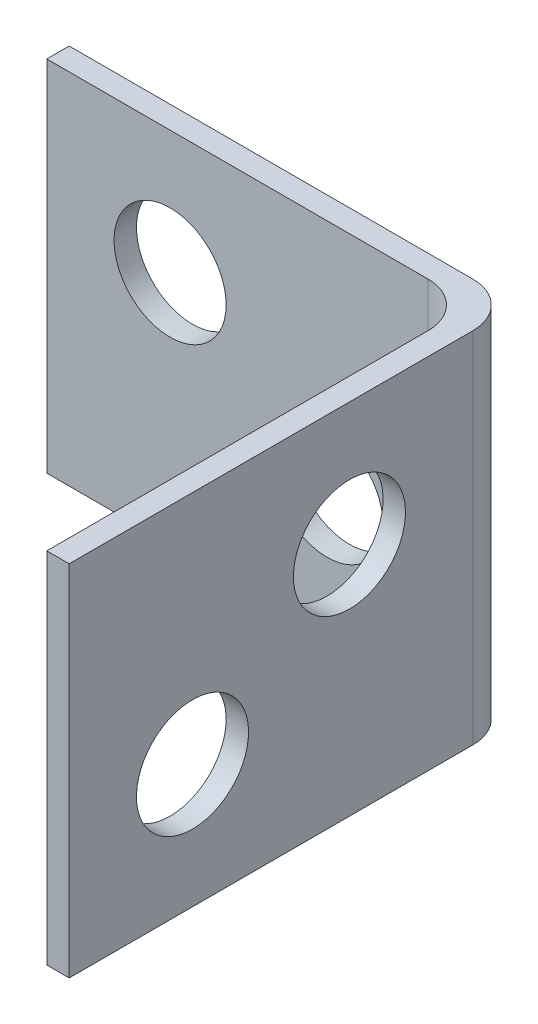
ISO-10303-21;
HEADER;
FILE_DESCRIPTION(('STEP AP214'),'2;1');
FILE_NAME('part.step','',(''),(''),'','','');
FILE_SCHEMA(('AUTOMOTIVE_DESIGN { 1 0 10303 214 1 1 1 1 }'));
ENDSEC;
DATA;
#1=APPLICATION_CONTEXT('core data for automotive mechanical design processes');
#2=APPLICATION_PROTOCOL_DEFINITION('international standard','automotive_design',2000,#1);
#3=PRODUCT_CONTEXT('',#1,'mechanical');
#4=PRODUCT('Part','Part','',(#3));
#5=PRODUCT_RELATED_PRODUCT_CATEGORY('part','',(#4));
#6=PRODUCT_DEFINITION_FORMATION('','',#4);
#7=PRODUCT_DEFINITION_CONTEXT('part definition',#1,'design');
#8=PRODUCT_DEFINITION('design','',#6,#7);
#9=PRODUCT_DEFINITION_SHAPE('','',#8);
#10=(LENGTH_UNIT() NAMED_UNIT(*) SI_UNIT(.MILLI.,.METRE.));
#11=(NAMED_UNIT(*) PLANE_ANGLE_UNIT() SI_UNIT($,.RADIAN.));
#12=(NAMED_UNIT(*) SI_UNIT($,.STERADIAN.) SOLID_ANGLE_UNIT());
#13=UNCERTAINTY_MEASURE_WITH_UNIT(LENGTH_MEASURE(1.E-05),#10,'distance_accuracy_value','');
#14=(GEOMETRIC_REPRESENTATION_CONTEXT(3) GLOBAL_UNCERTAINTY_ASSIGNED_CONTEXT((#13)) GLOBAL_UNIT_ASSIGNED_CONTEXT((#10,
#11,#12)) REPRESENTATION_CONTEXT('',''));
#15=CARTESIAN_POINT('',(0.,0.,0.));
#16=DIRECTION('',(0.,0.,1.));
#17=DIRECTION('',(1.,0.,0.));
#18=AXIS2_PLACEMENT_3D('',#15,#16,#17);
#19=CARTESIAN_POINT('',(0.,0.,1.));
#20=DIRECTION('',(0.,0.,-1.));
#21=DIRECTION('',(-1.,0.,0.));
#22=AXIS2_PLACEMENT_3D('',#19,#20,#21);
#23=PLANE('',#22);
#24=CARTESIAN_POINT('',(12.5,5.5,1.));
#25=DIRECTION('',(0.,0.,1.));
#26=DIRECTION('',(1.,0.,0.));
#27=AXIS2_PLACEMENT_3D('',#24,#25,#26);
#28=CIRCLE('',#27,2.5);
#29=CARTESIAN_POINT('',(15.,5.5,1.));
#30=VERTEX_POINT('',#29);
#31=EDGE_CURVE('E152',#30,#30,#28,.T.);
#32=ORIENTED_EDGE('',*,*,#31,.F.);
#33=EDGE_LOOP('',(#32));
#34=FACE_BOUND('',#33,.T.);
#35=CARTESIAN_POINT('',(5.5,10.5,1.));
#36=DIRECTION('',(0.,0.,1.));
#37=DIRECTION('',(1.,0.,0.));
#38=AXIS2_PLACEMENT_3D('',#35,#36,#37);
#39=CIRCLE('',#38,2.5);
#40=CARTESIAN_POINT('',(8.,10.5,1.));
#41=VERTEX_POINT('',#40);
#42=EDGE_CURVE('E160',#41,#41,#39,.T.);
#43=ORIENTED_EDGE('',*,*,#42,.F.);
#44=EDGE_LOOP('',(#43));
#45=FACE_BOUND('',#44,.T.);
#46=DIRECTION('',(1.,0.,0.));
#47=VECTOR('',#46,1.);
#48=CARTESIAN_POINT('',(0.,0.,1.));
#49=LINE('',#48,#47);
#50=CARTESIAN_POINT('',(0.,0.,1.));
#51=VERTEX_POINT('',#50);
#52=CARTESIAN_POINT('',(17.,0.,1.));
#53=VERTEX_POINT('',#52);
#54=EDGE_CURVE('E172',#51,#53,#49,.T.);
#55=ORIENTED_EDGE('',*,*,#54,.T.);
#56=DIRECTION('',(0.,-1.,0.));
#57=VECTOR('',#56,1.);
#58=CARTESIAN_POINT('',(17.,16.,1.));
#59=LINE('',#58,#57);
#60=CARTESIAN_POINT('',(17.,16.,1.));
#61=VERTEX_POINT('',#60);
#62=EDGE_CURVE('E211',#53,#61,#59,.F.);
#63=ORIENTED_EDGE('',*,*,#62,.T.);
#64=DIRECTION('',(-1.,0.,0.));
#65=VECTOR('',#64,1.);
#66=CARTESIAN_POINT('',(0.,16.,1.));
#67=LINE('',#66,#65);
#68=CARTESIAN_POINT('',(0.,16.,1.));
#69=VERTEX_POINT('',#68);
#70=EDGE_CURVE('E176',#61,#69,#67,.T.);
#71=ORIENTED_EDGE('',*,*,#70,.T.);
#72=DIRECTION('',(0.,-1.,0.));
#73=VECTOR('',#72,1.);
#74=CARTESIAN_POINT('',(0.,0.,1.));
#75=LINE('',#74,#73);
#76=EDGE_CURVE('E168',#69,#51,#75,.T.);
#77=ORIENTED_EDGE('',*,*,#76,.T.);
#78=EDGE_LOOP('',(#55,#63,#71,#77));
#79=FACE_BOUND('',#78,.T.);
#80=ADVANCED_FACE('F39',(#34,#45,#79),#23,.F.);
#81=CARTESIAN_POINT('',(0.,0.,0.));
#82=DIRECTION('',(0.,0.,-1.));
#83=DIRECTION('',(-1.,0.,0.));
#84=AXIS2_PLACEMENT_3D('',#81,#82,#83);
#85=PLANE('',#84);
#86=CARTESIAN_POINT('',(5.5,10.5,0.));
#87=DIRECTION('',(0.,0.,1.));
#88=DIRECTION('',(1.,0.,0.));
#89=AXIS2_PLACEMENT_3D('',#86,#87,#88);
#90=CIRCLE('',#89,2.5);
#91=CARTESIAN_POINT('',(8.,10.5,0.));
#92=VERTEX_POINT('',#91);
#93=EDGE_CURVE('E156',#92,#92,#90,.T.);
#94=ORIENTED_EDGE('',*,*,#93,.T.);
#95=EDGE_LOOP('',(#94));
#96=FACE_BOUND('',#95,.T.);
#97=DIRECTION('',(-1.,0.,0.));
#98=VECTOR('',#97,1.);
#99=CARTESIAN_POINT('',(0.,16.,0.));
#100=LINE('',#99,#98);
#101=CARTESIAN_POINT('',(18.,16.,0.));
#102=VERTEX_POINT('',#101);
#103=CARTESIAN_POINT('',(0.,16.,0.));
#104=VERTEX_POINT('',#103);
#105=EDGE_CURVE('E173',#102,#104,#100,.T.);
#106=ORIENTED_EDGE('',*,*,#105,.F.);
#107=DIRECTION('',(0.,1.,0.));
#108=VECTOR('',#107,1.);
#109=CARTESIAN_POINT('',(18.,0.,0.));
#110=LINE('',#109,#108);
#111=CARTESIAN_POINT('',(18.,0.,0.));
#112=VERTEX_POINT('',#111);
#113=EDGE_CURVE('E202',#102,#112,#110,.F.);
#114=ORIENTED_EDGE('',*,*,#113,.T.);
#115=DIRECTION('',(1.,0.,0.));
#116=VECTOR('',#115,1.);
#117=CARTESIAN_POINT('',(0.,0.,0.));
#118=LINE('',#117,#116);
#119=CARTESIAN_POINT('',(0.,0.,0.));
#120=VERTEX_POINT('',#119);
#121=EDGE_CURVE('E182',#120,#112,#118,.T.);
#122=ORIENTED_EDGE('',*,*,#121,.F.);
#123=DIRECTION('',(0.,-1.,0.));
#124=VECTOR('',#123,1.);
#125=CARTESIAN_POINT('',(0.,0.,0.));
#126=LINE('',#125,#124);
#127=EDGE_CURVE('E164',#104,#120,#126,.T.);
#128=ORIENTED_EDGE('',*,*,#127,.F.);
#129=EDGE_LOOP('',(#106,#114,#122,#128));
#130=FACE_BOUND('',#129,.T.);
#131=CARTESIAN_POINT('',(12.5,5.5,0.));
#132=DIRECTION('',(0.,0.,1.));
#133=DIRECTION('',(1.,0.,0.));
#134=AXIS2_PLACEMENT_3D('',#131,#132,#133);
#135=CIRCLE('',#134,2.5);
#136=CARTESIAN_POINT('',(15.,5.5,0.));
#137=VERTEX_POINT('',#136);
#138=EDGE_CURVE('E151',#137,#137,#135,.T.);
#139=ORIENTED_EDGE('',*,*,#138,.T.);
#140=EDGE_LOOP('',(#139));
#141=FACE_BOUND('',#140,.T.);
#142=ADVANCED_FACE('F230',(#96,#130,#141),#85,.T.);
#143=CARTESIAN_POINT('',(0.,0.,1.));
#144=DIRECTION('',(1.,0.,0.));
#145=DIRECTION('',(0.,0.,-1.));
#146=AXIS2_PLACEMENT_3D('',#143,#144,#145);
#147=PLANE('',#146);
#148=ORIENTED_EDGE('',*,*,#127,.T.);
#149=DIRECTION('',(0.,0.,-1.));
#150=VECTOR('',#149,1.);
#151=CARTESIAN_POINT('',(0.,0.,1.));
#152=LINE('',#151,#150);
#153=EDGE_CURVE('E193',#51,#120,#152,.T.);
#154=ORIENTED_EDGE('',*,*,#153,.F.);
#155=ORIENTED_EDGE('',*,*,#76,.F.);
#156=DIRECTION('',(0.,0.,-1.));
#157=VECTOR('',#156,1.);
#158=CARTESIAN_POINT('',(0.,16.,1.));
#159=LINE('',#158,#157);
#160=EDGE_CURVE('E115',#69,#104,#159,.T.);
#161=ORIENTED_EDGE('',*,*,#160,.T.);
#162=EDGE_LOOP('',(#148,#154,#155,#161));
#163=FACE_BOUND('',#162,.T.);
#164=ADVANCED_FACE('F234',(#163),#147,.F.);
#165=CARTESIAN_POINT('',(0.,0.,1.));
#166=DIRECTION('',(0.,1.,0.));
#167=DIRECTION('',(0.,0.,1.));
#168=AXIS2_PLACEMENT_3D('',#165,#166,#167);
#169=PLANE('',#168);
#170=ORIENTED_EDGE('',*,*,#121,.T.);
#171=CARTESIAN_POINT('',(18.,0.,2.));
#172=DIRECTION('',(0.,1.,0.));
#173=DIRECTION('',(0.,0.,1.));
#174=AXIS2_PLACEMENT_3D('',#171,#172,#173);
#175=CIRCLE('',#174,2.);
#176=CARTESIAN_POINT('',(20.,0.,2.));
#177=VERTEX_POINT('',#176);
#178=EDGE_CURVE('E205',#112,#177,#175,.F.);
#179=ORIENTED_EDGE('',*,*,#178,.T.);
#180=DIRECTION('',(0.,0.,-1.));
#181=VECTOR('',#180,1.);
#182=CARTESIAN_POINT('',(20.,0.,1.));
#183=LINE('',#182,#181);
#184=CARTESIAN_POINT('',(20.,0.,20.));
#185=VERTEX_POINT('',#184);
#186=EDGE_CURVE('E114',#185,#177,#183,.T.);
#187=ORIENTED_EDGE('',*,*,#186,.F.);
#188=DIRECTION('',(1.,0.,0.));
#189=VECTOR('',#188,1.);
#190=CARTESIAN_POINT('',(20.,0.,20.));
#191=LINE('',#190,#189);
#192=CARTESIAN_POINT('',(19.,0.,20.));
#193=VERTEX_POINT('',#192);
#194=EDGE_CURVE('E130',#193,#185,#191,.T.);
#195=ORIENTED_EDGE('',*,*,#194,.F.);
#196=DIRECTION('',(0.,0.,-1.));
#197=VECTOR('',#196,1.);
#198=CARTESIAN_POINT('',(19.,0.,20.));
#199=LINE('',#198,#197);
#200=CARTESIAN_POINT('',(19.,0.,3.));
#201=VERTEX_POINT('',#200);
#202=EDGE_CURVE('E146',#193,#201,#199,.T.);
#203=ORIENTED_EDGE('',*,*,#202,.T.);
#204=CARTESIAN_POINT('',(17.,0.,3.));
#205=DIRECTION('',(0.,1.,0.));
#206=DIRECTION('',(0.,0.,1.));
#207=AXIS2_PLACEMENT_3D('',#204,#205,#206);
#208=CIRCLE('',#207,2.);
#209=EDGE_CURVE('E48',#201,#53,#208,.T.);
#210=ORIENTED_EDGE('',*,*,#209,.T.);
#211=ORIENTED_EDGE('',*,*,#54,.F.);
#212=ORIENTED_EDGE('',*,*,#153,.T.);
#213=EDGE_LOOP('',(#170,#179,#187,#195,#203,#210,#211,#212));
#214=FACE_BOUND('',#213,.T.);
#215=ADVANCED_FACE('F222',(#214),#169,.F.);
#216=CARTESIAN_POINT('',(20.,0.,1.));
#217=DIRECTION('',(-1.,0.,0.));
#218=DIRECTION('',(0.,0.,1.));
#219=AXIS2_PLACEMENT_3D('',#216,#217,#218);
#220=PLANE('',#219);
#221=CARTESIAN_POINT('',(20.,10.5,7.5));
#222=DIRECTION('',(-1.,0.,0.));
#223=DIRECTION('',(0.,-1.,0.));
#224=AXIS2_PLACEMENT_3D('',#221,#222,#223);
#225=CIRCLE('',#224,2.5);
#226=CARTESIAN_POINT('',(20.,8.,7.5));
#227=VERTEX_POINT('',#226);
#228=EDGE_CURVE('E132',#227,#227,#225,.T.);
#229=ORIENTED_EDGE('',*,*,#228,.T.);
#230=EDGE_LOOP('',(#229));
#231=FACE_BOUND('',#230,.T.);
#232=CARTESIAN_POINT('',(20.,5.5,14.5));
#233=DIRECTION('',(-1.,0.,0.));
#234=DIRECTION('',(0.,-1.,0.));
#235=AXIS2_PLACEMENT_3D('',#232,#233,#234);
#236=CIRCLE('',#235,2.5);
#237=CARTESIAN_POINT('',(20.,3.,14.5));
#238=VERTEX_POINT('',#237);
#239=EDGE_CURVE('E265',#238,#238,#236,.T.);
#240=ORIENTED_EDGE('',*,*,#239,.T.);
#241=EDGE_LOOP('',(#240));
#242=FACE_BOUND('',#241,.T.);
#243=ORIENTED_EDGE('',*,*,#186,.T.);
#244=DIRECTION('',(0.,1.,0.));
#245=VECTOR('',#244,1.);
#246=CARTESIAN_POINT('',(20.,16.,2.));
#247=LINE('',#246,#245);
#248=CARTESIAN_POINT('',(20.,16.,2.));
#249=VERTEX_POINT('',#248);
#250=EDGE_CURVE('E111',#177,#249,#247,.T.);
#251=ORIENTED_EDGE('',*,*,#250,.T.);
#252=DIRECTION('',(0.,0.,-1.));
#253=VECTOR('',#252,1.);
#254=CARTESIAN_POINT('',(20.,16.,1.));
#255=LINE('',#254,#253);
#256=CARTESIAN_POINT('',(20.,16.,20.));
#257=VERTEX_POINT('',#256);
#258=EDGE_CURVE('E104',#257,#249,#255,.T.);
#259=ORIENTED_EDGE('',*,*,#258,.F.);
#260=DIRECTION('',(0.,1.,0.));
#261=VECTOR('',#260,1.);
#262=CARTESIAN_POINT('',(20.,16.,20.));
#263=LINE('',#262,#261);
#264=EDGE_CURVE('E109',#185,#257,#263,.T.);
#265=ORIENTED_EDGE('',*,*,#264,.F.);
#266=EDGE_LOOP('',(#243,#251,#259,#265));
#267=FACE_BOUND('',#266,.T.);
#268=ADVANCED_FACE('F107',(#231,#242,#267),#220,.F.);
#269=CARTESIAN_POINT('',(0.,16.,1.));
#270=DIRECTION('',(0.,-1.,0.));
#271=DIRECTION('',(0.,0.,-1.));
#272=AXIS2_PLACEMENT_3D('',#269,#270,#271);
#273=PLANE('',#272);
#274=ORIENTED_EDGE('',*,*,#258,.T.);
#275=CARTESIAN_POINT('',(18.,16.,2.));
#276=DIRECTION('',(0.,-1.,0.));
#277=DIRECTION('',(0.,0.,-1.));
#278=AXIS2_PLACEMENT_3D('',#275,#276,#277);
#279=CIRCLE('',#278,2.);
#280=EDGE_CURVE('E199',#249,#102,#279,.F.);
#281=ORIENTED_EDGE('',*,*,#280,.T.);
#282=ORIENTED_EDGE('',*,*,#105,.T.);
#283=ORIENTED_EDGE('',*,*,#160,.F.);
#284=ORIENTED_EDGE('',*,*,#70,.F.);
#285=CARTESIAN_POINT('',(17.,16.,3.));
#286=DIRECTION('',(0.,-1.,0.));
#287=DIRECTION('',(0.,0.,-1.));
#288=AXIS2_PLACEMENT_3D('',#285,#286,#287);
#289=CIRCLE('',#288,2.);
#290=CARTESIAN_POINT('',(19.,16.,3.));
#291=VERTEX_POINT('',#290);
#292=EDGE_CURVE('E11',#61,#291,#289,.T.);
#293=ORIENTED_EDGE('',*,*,#292,.T.);
#294=DIRECTION('',(0.,0.,-1.));
#295=VECTOR('',#294,1.);
#296=CARTESIAN_POINT('',(19.,16.,20.));
#297=LINE('',#296,#295);
#298=CARTESIAN_POINT('',(19.,16.,20.));
#299=VERTEX_POINT('',#298);
#300=EDGE_CURVE('E121',#299,#291,#297,.T.);
#301=ORIENTED_EDGE('',*,*,#300,.F.);
#302=DIRECTION('',(-1.,0.,0.));
#303=VECTOR('',#302,1.);
#304=CARTESIAN_POINT('',(20.,16.,20.));
#305=LINE('',#304,#303);
#306=EDGE_CURVE('E118',#257,#299,#305,.T.);
#307=ORIENTED_EDGE('',*,*,#306,.F.);
#308=EDGE_LOOP('',(#274,#281,#282,#283,#284,#293,#301,#307));
#309=FACE_BOUND('',#308,.T.);
#310=ADVANCED_FACE('F119',(#309),#273,.F.);
#311=CARTESIAN_POINT('',(5.5,10.5,1.));
#312=DIRECTION('',(0.,0.,-1.));
#313=DIRECTION('',(-1.,0.,0.));
#314=AXIS2_PLACEMENT_3D('',#311,#312,#313);
#315=CYLINDRICAL_SURFACE('',#314,2.5);
#316=ORIENTED_EDGE('',*,*,#42,.T.);
#317=EDGE_LOOP('',(#316));
#318=FACE_BOUND('',#317,.T.);
#319=ORIENTED_EDGE('',*,*,#93,.F.);
#320=EDGE_LOOP('',(#319));
#321=FACE_BOUND('',#320,.T.);
#322=ADVANCED_FACE('F252',(#318,#321),#315,.F.);
#323=CARTESIAN_POINT('',(12.5,5.5,1.));
#324=DIRECTION('',(0.,0.,-1.));
#325=DIRECTION('',(-1.,0.,0.));
#326=AXIS2_PLACEMENT_3D('',#323,#324,#325);
#327=CYLINDRICAL_SURFACE('',#326,2.5);
#328=ORIENTED_EDGE('',*,*,#31,.T.);
#329=EDGE_LOOP('',(#328));
#330=FACE_BOUND('',#329,.T.);
#331=ORIENTED_EDGE('',*,*,#138,.F.);
#332=EDGE_LOOP('',(#331));
#333=FACE_BOUND('',#332,.T.);
#334=ADVANCED_FACE('F278',(#330,#333),#327,.F.);
#335=CARTESIAN_POINT('',(19.,16.,20.));
#336=DIRECTION('',(1.,0.,0.));
#337=DIRECTION('',(0.,1.,0.));
#338=AXIS2_PLACEMENT_3D('',#335,#336,#337);
#339=PLANE('',#338);
#340=CARTESIAN_POINT('',(19.,10.5,7.5));
#341=DIRECTION('',(-1.,0.,0.));
#342=DIRECTION('',(0.,-1.,0.));
#343=AXIS2_PLACEMENT_3D('',#340,#341,#342);
#344=CIRCLE('',#343,2.5);
#345=CARTESIAN_POINT('',(19.,8.,7.5));
#346=VERTEX_POINT('',#345);
#347=EDGE_CURVE('E136',#346,#346,#344,.T.);
#348=ORIENTED_EDGE('',*,*,#347,.F.);
#349=EDGE_LOOP('',(#348));
#350=FACE_BOUND('',#349,.T.);
#351=CARTESIAN_POINT('',(19.,5.5,14.5));
#352=DIRECTION('',(-1.,0.,0.));
#353=DIRECTION('',(0.,-1.,0.));
#354=AXIS2_PLACEMENT_3D('',#351,#352,#353);
#355=CIRCLE('',#354,2.5);
#356=CARTESIAN_POINT('',(19.,3.,14.5));
#357=VERTEX_POINT('',#356);
#358=EDGE_CURVE('E139',#357,#357,#355,.T.);
#359=ORIENTED_EDGE('',*,*,#358,.F.);
#360=EDGE_LOOP('',(#359));
#361=FACE_BOUND('',#360,.T.);
#362=ORIENTED_EDGE('',*,*,#300,.T.);
#363=DIRECTION('',(0.,-1.,0.));
#364=VECTOR('',#363,1.);
#365=CARTESIAN_POINT('',(19.,0.,3.));
#366=LINE('',#365,#364);
#367=EDGE_CURVE('E208',#291,#201,#366,.T.);
#368=ORIENTED_EDGE('',*,*,#367,.T.);
#369=ORIENTED_EDGE('',*,*,#202,.F.);
#370=DIRECTION('',(0.,-1.,0.));
#371=VECTOR('',#370,1.);
#372=CARTESIAN_POINT('',(19.,16.,20.));
#373=LINE('',#372,#371);
#374=EDGE_CURVE('E125',#299,#193,#373,.T.);
#375=ORIENTED_EDGE('',*,*,#374,.F.);
#376=EDGE_LOOP('',(#362,#368,#369,#375));
#377=FACE_BOUND('',#376,.T.);
#378=ADVANCED_FACE('F221',(#350,#361,#377),#339,.F.);
#379=CARTESIAN_POINT('',(0.,0.,20.));
#380=DIRECTION('',(0.,0.,-1.));
#381=DIRECTION('',(-1.,0.,0.));
#382=AXIS2_PLACEMENT_3D('',#379,#380,#381);
#383=PLANE('',#382);
#384=ORIENTED_EDGE('',*,*,#264,.T.);
#385=ORIENTED_EDGE('',*,*,#306,.T.);
#386=ORIENTED_EDGE('',*,*,#374,.T.);
#387=ORIENTED_EDGE('',*,*,#194,.T.);
#388=EDGE_LOOP('',(#384,#385,#386,#387));
#389=FACE_BOUND('',#388,.T.);
#390=ADVANCED_FACE('F128',(#389),#383,.F.);
#391=CARTESIAN_POINT('',(20.,5.5,14.5));
#392=DIRECTION('',(-1.,0.,0.));
#393=DIRECTION('',(0.,-1.,0.));
#394=AXIS2_PLACEMENT_3D('',#391,#392,#393);
#395=CYLINDRICAL_SURFACE('',#394,2.5);
#396=ORIENTED_EDGE('',*,*,#239,.F.);
#397=EDGE_LOOP('',(#396));
#398=FACE_BOUND('',#397,.T.);
#399=ORIENTED_EDGE('',*,*,#358,.T.);
#400=EDGE_LOOP('',(#399));
#401=FACE_BOUND('',#400,.T.);
#402=ADVANCED_FACE('F275',(#398,#401),#395,.F.);
#403=CARTESIAN_POINT('',(20.,10.5,7.5));
#404=DIRECTION('',(-1.,0.,0.));
#405=DIRECTION('',(0.,-1.,0.));
#406=AXIS2_PLACEMENT_3D('',#403,#404,#405);
#407=CYLINDRICAL_SURFACE('',#406,2.5);
#408=ORIENTED_EDGE('',*,*,#228,.F.);
#409=EDGE_LOOP('',(#408));
#410=FACE_BOUND('',#409,.T.);
#411=ORIENTED_EDGE('',*,*,#347,.T.);
#412=EDGE_LOOP('',(#411));
#413=FACE_BOUND('',#412,.T.);
#414=ADVANCED_FACE('F291',(#410,#413),#407,.F.);
#415=CARTESIAN_POINT('',(18.,0.,2.));
#416=DIRECTION('',(0.,-1.,0.));
#417=DIRECTION('',(0.,0.,-1.));
#418=AXIS2_PLACEMENT_3D('',#415,#416,#417);
#419=CYLINDRICAL_SURFACE('',#418,2.);
#420=ORIENTED_EDGE('',*,*,#178,.F.);
#421=ORIENTED_EDGE('',*,*,#113,.F.);
#422=ORIENTED_EDGE('',*,*,#280,.F.);
#423=ORIENTED_EDGE('',*,*,#250,.F.);
#424=EDGE_LOOP('',(#420,#421,#422,#423));
#425=FACE_BOUND('',#424,.T.);
#426=ADVANCED_FACE('F225',(#425),#419,.T.);
#427=CARTESIAN_POINT('',(17.,16.,3.));
#428=DIRECTION('',(0.,1.,0.));
#429=DIRECTION('',(-1.,0.,0.));
#430=AXIS2_PLACEMENT_3D('',#427,#428,#429);
#431=CYLINDRICAL_SURFACE('',#430,2.);
#432=ORIENTED_EDGE('',*,*,#292,.F.);
#433=ORIENTED_EDGE('',*,*,#62,.F.);
#434=ORIENTED_EDGE('',*,*,#209,.F.);
#435=ORIENTED_EDGE('',*,*,#367,.F.);
#436=EDGE_LOOP('',(#432,#433,#434,#435));
#437=FACE_BOUND('',#436,.T.);
#438=ADVANCED_FACE('F41',(#437),#431,.F.);
#439=CLOSED_SHELL('',(#80,#142,#164,#215,#268,#310,#322,#334,#378,#390,#402,#414,#426,#438));
#440=MANIFOLD_SOLID_BREP('B2',#439);
#441=ADVANCED_BREP_SHAPE_REPRESENTATION('',(#18,#440),#14);
#442=SHAPE_DEFINITION_REPRESENTATION(#9,#441);
ENDSEC;
END-ISO-10303-21;
